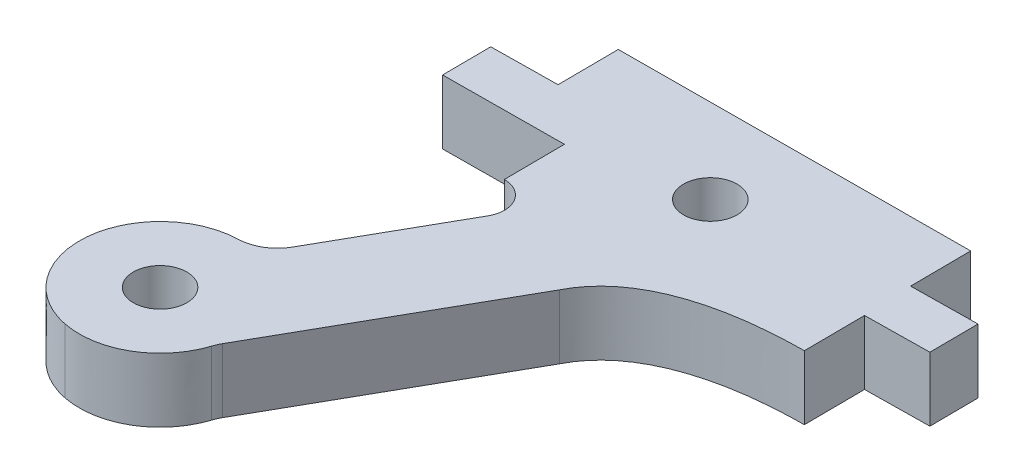
ISO-10303-21;
HEADER;
FILE_DESCRIPTION(('STEP AP214'),'2;1');
FILE_NAME('part.step','',(''),(''),'','','');
FILE_SCHEMA(('AUTOMOTIVE_DESIGN { 1 0 10303 214 1 1 1 1 }'));
ENDSEC;
DATA;
#1=APPLICATION_CONTEXT('core data for automotive mechanical design processes');
#2=APPLICATION_PROTOCOL_DEFINITION('international standard','automotive_design',2000,#1);
#3=PRODUCT_CONTEXT('',#1,'mechanical');
#4=PRODUCT('Part','Part','',(#3));
#5=PRODUCT_RELATED_PRODUCT_CATEGORY('part','',(#4));
#6=PRODUCT_DEFINITION_FORMATION('','',#4);
#7=PRODUCT_DEFINITION_CONTEXT('part definition',#1,'design');
#8=PRODUCT_DEFINITION('design','',#6,#7);
#9=PRODUCT_DEFINITION_SHAPE('','',#8);
#10=(LENGTH_UNIT() NAMED_UNIT(*) SI_UNIT(.MILLI.,.METRE.));
#11=(NAMED_UNIT(*) PLANE_ANGLE_UNIT() SI_UNIT($,.RADIAN.));
#12=(NAMED_UNIT(*) SI_UNIT($,.STERADIAN.) SOLID_ANGLE_UNIT());
#13=UNCERTAINTY_MEASURE_WITH_UNIT(LENGTH_MEASURE(1.E-05),#10,'distance_accuracy_value','');
#14=(GEOMETRIC_REPRESENTATION_CONTEXT(3) GLOBAL_UNCERTAINTY_ASSIGNED_CONTEXT((#13)) GLOBAL_UNIT_ASSIGNED_CONTEXT((#10,
#11,#12)) REPRESENTATION_CONTEXT('',''));
#15=CARTESIAN_POINT('',(0.,0.,0.));
#16=DIRECTION('',(0.,0.,1.));
#17=DIRECTION('',(1.,0.,0.));
#18=AXIS2_PLACEMENT_3D('',#15,#16,#17);
#19=CARTESIAN_POINT('',(-2.34833379742237,3.175,-1.86520467732021));
#20=DIRECTION('',(0.,1.,0.));
#21=DIRECTION('',(0.,0.,1.));
#22=AXIS2_PLACEMENT_3D('',#19,#20,#21);
#23=PLANE('',#22);
#24=CARTESIAN_POINT('',(2.95169046687696,3.175,-6.28082987669765));
#25=DIRECTION('',(0.,1.,0.));
#26=DIRECTION('',(0.,0.,1.));
#27=AXIS2_PLACEMENT_3D('',#24,#25,#26);
#28=CIRCLE('',#27,1.32389540963703);
#29=CARTESIAN_POINT('',(2.95169046687696,3.175,-4.95693446706062));
#30=VERTEX_POINT('',#29);
#31=EDGE_CURVE('E223',#30,#30,#28,.T.);
#32=ORIENTED_EDGE('',*,*,#31,.F.);
#33=EDGE_LOOP('',(#32));
#34=FACE_BOUND('',#33,.T.);
#35=DIRECTION('',(-0.999987225720745,0.,0.00505454204919025));
#36=VECTOR('',#35,1.);
#37=CARTESIAN_POINT('',(11.6055718938665,3.175,-10.5246438774155));
#38=LINE('',#37,#36);
#39=CARTESIAN_POINT('',(11.6055718938665,3.175,-10.5246438774155));
#40=VERTEX_POINT('',#39);
#41=CARTESIAN_POINT('',(-5.76646373639117,3.175,-10.4368350711481));
#42=VERTEX_POINT('',#41);
#43=EDGE_CURVE('E314',#40,#42,#38,.T.);
#44=ORIENTED_EDGE('',*,*,#43,.T.);
#45=DIRECTION('',(1.,0.,0.));
#46=VECTOR('',#45,1.);
#47=CARTESIAN_POINT('',(-5.76646373639117,3.175,-10.4368350711481));
#48=LINE('',#47,#46);
#49=CARTESIAN_POINT('',(-5.7633977894373,3.175,-10.4368350711481));
#50=VERTEX_POINT('',#49);
#51=EDGE_CURVE('E137',#42,#50,#48,.T.);
#52=ORIENTED_EDGE('',*,*,#51,.T.);
#53=DIRECTION('',(0.00730458912248284,0.,0.999973321132995));
#54=VECTOR('',#53,1.);
#55=CARTESIAN_POINT('',(-5.7633977894373,3.175,-10.4368350711481));
#56=LINE('',#55,#54);
#57=CARTESIAN_POINT('',(-5.74148284919351,3.175,-7.4367545449818));
#58=VERTEX_POINT('',#57);
#59=EDGE_CURVE('E431',#50,#58,#56,.T.);
#60=ORIENTED_EDGE('',*,*,#59,.T.);
#61=DIRECTION('',(0.,0.,1.));
#62=VECTOR('',#61,1.);
#63=CARTESIAN_POINT('',(-5.74148284919351,3.175,-7.4367545449818));
#64=LINE('',#63,#62);
#65=CARTESIAN_POINT('',(-5.74148284919351,3.175,-7.43457665998876));
#66=VERTEX_POINT('',#65);
#67=EDGE_CURVE('E450',#58,#66,#64,.T.);
#68=ORIENTED_EDGE('',*,*,#67,.T.);
#69=DIRECTION('',(-0.99991975145842,0.,0.0126684901756899));
#70=VECTOR('',#69,1.);
#71=CARTESIAN_POINT('',(-5.74148284919351,3.175,-7.43457665998876));
#72=LINE('',#71,#70);
#73=CARTESIAN_POINT('',(-9.03532860903988,3.175,-7.39284525845579));
#74=VERTEX_POINT('',#73);
#75=EDGE_CURVE('E447',#66,#74,#72,.T.);
#76=ORIENTED_EDGE('',*,*,#75,.T.);
#77=DIRECTION('',(0.00732152725886782,0.,0.999973197260105));
#78=VECTOR('',#77,1.);
#79=CARTESIAN_POINT('',(-9.03532860903988,3.175,-7.39284525845579));
#80=LINE('',#79,#78);
#81=CARTESIAN_POINT('',(-9.01775668742399,3.175,-4.9928745940071));
#82=VERTEX_POINT('',#81);
#83=EDGE_CURVE('E449',#74,#82,#80,.T.);
#84=ORIENTED_EDGE('',*,*,#83,.T.);
#85=DIRECTION('',(0.99997313805182,0.,-0.0073296094572015));
#86=VECTOR('',#85,1.);
#87=CARTESIAN_POINT('',(-9.01775668742399,3.175,-4.9928745940071));
#88=LINE('',#87,#86);
#89=CARTESIAN_POINT('',(-3.02857798229572,3.175,-5.03677411411171));
#90=VERTEX_POINT('',#89);
#91=EDGE_CURVE('E452',#82,#90,#88,.T.);
#92=ORIENTED_EDGE('',*,*,#91,.T.);
#93=DIRECTION('',(0.00723946370180525,0.,0.999973794739297));
#94=VECTOR('',#93,1.);
#95=CARTESIAN_POINT('',(-3.02857798229572,3.175,-5.03677411411171));
#96=LINE('',#95,#94);
#97=CARTESIAN_POINT('',(-3.00685801482997,3.175,-2.03663499014264));
#98=VERTEX_POINT('',#97);
#99=EDGE_CURVE('E458',#90,#98,#96,.T.);
#100=ORIENTED_EDGE('',*,*,#99,.T.);
#101=CARTESIAN_POINT('',(-3.00685801482997,3.175,-2.03663499014264));
#102=CARTESIAN_POINT('',(-2.53721245866417,3.175,-2.04027782017716));
#103=CARTESIAN_POINT('',(-2.10149216608579,3.175,-1.79245794707872));
#104=CARTESIAN_POINT('',(-1.86369849029905,3.175,-1.38679512665141));
#105=B_SPLINE_CURVE_WITH_KNOTS('',3,(#101,#102,#103,#104),.UNSPECIFIED.,.F.,.F.,(4,4),(7.,8.),.UNSPECIFIED.);
#106=CARTESIAN_POINT('',(-1.86369849029905,3.175,-1.38679512665141));
#107=VERTEX_POINT('',#106);
#108=EDGE_CURVE('E460',#98,#107,#105,.T.);
#109=ORIENTED_EDGE('',*,*,#108,.T.);
#110=CARTESIAN_POINT('',(-1.86369849029905,3.175,-1.38679512665141));
#111=CARTESIAN_POINT('',(-1.6259048145123,3.175,-0.981269034429327));
#112=CARTESIAN_POINT('',(-1.6223270640357,3.175,-0.479281193001224));
#113=CARTESIAN_POINT('',(-1.8541107039417,3.175,-0.0701025044446135));
#114=B_SPLINE_CURVE_WITH_KNOTS('',3,(#110,#111,#112,#113),.UNSPECIFIED.,.F.,.F.,(4,4),(8.,9.),.UNSPECIFIED.);
#115=CARTESIAN_POINT('',(-1.8541107039417,3.175,-0.0701025044446135));
#116=VERTEX_POINT('',#115);
#117=EDGE_CURVE('E465',#107,#116,#114,.T.);
#118=ORIENTED_EDGE('',*,*,#117,.T.);
#119=DIRECTION('',(-0.492967266484552,0.,0.870047857404838));
#120=VECTOR('',#119,1.);
#121=CARTESIAN_POINT('',(-1.8541107039417,3.175,-0.0701025044446135));
#122=LINE('',#121,#120);
#123=CARTESIAN_POINT('',(-5.35188824244559,3.175,6.10319552151964));
#124=VERTEX_POINT('',#123);
#125=EDGE_CURVE('E756',#116,#124,#122,.T.);
#126=ORIENTED_EDGE('',*,*,#125,.T.);
#127=CARTESIAN_POINT('',(-5.35188824244559,3.175,6.10319552151964));
#128=CARTESIAN_POINT('',(-5.69580072766479,3.175,6.71008319570995));
#129=CARTESIAN_POINT('',(-6.33040787799283,3.175,7.09346908484737));
#130=CARTESIAN_POINT('',(-7.02673366155127,3.175,7.115042842437));
#131=B_SPLINE_CURVE_WITH_KNOTS('',3,(#127,#128,#129,#130),.UNSPECIFIED.,.F.,.F.,(4,4),(10.,11.),.UNSPECIFIED.);
#132=CARTESIAN_POINT('',(-7.02673366155127,3.175,7.115042842437));
#133=VERTEX_POINT('',#132);
#134=EDGE_CURVE('E754',#124,#133,#131,.T.);
#135=ORIENTED_EDGE('',*,*,#134,.T.);
#136=CARTESIAN_POINT('',(-7.02673366155127,3.175,7.115042842437));
#137=CARTESIAN_POINT('',(-9.0532807283355,3.175,7.17763506171815));
#138=CARTESIAN_POINT('',(-10.7114462262083,3.175,8.75188455844386));
#139=CARTESIAN_POINT('',(-10.8824129820415,3.175,10.7759014883355));
#140=B_SPLINE_CURVE_WITH_KNOTS('',3,(#136,#137,#138,#139),.UNSPECIFIED.,.F.,.F.,(4,4),(11.,12.),.UNSPECIFIED.);
#141=CARTESIAN_POINT('',(-10.8824129820415,3.175,10.7759014883355));
#142=VERTEX_POINT('',#141);
#143=EDGE_CURVE('E747',#133,#142,#140,.T.);
#144=ORIENTED_EDGE('',*,*,#143,.T.);
#145=CARTESIAN_POINT('',(-10.8824129820415,3.175,10.7759014883355));
#146=CARTESIAN_POINT('',(-11.0531896394143,3.175,12.7999770160305));
#147=CARTESIAN_POINT('',(-9.68296969062521,3.175,14.6309532519513));
#148=CARTESIAN_POINT('',(-7.69558290655992,3.175,15.0339205735425));
#149=B_SPLINE_CURVE_WITH_KNOTS('',3,(#145,#146,#147,#148),.UNSPECIFIED.,.F.,.F.,(4,4),(12.,13.),.UNSPECIFIED.);
#150=CARTESIAN_POINT('',(-7.69558290655992,3.175,15.0339205735425));
#151=VERTEX_POINT('',#150);
#152=EDGE_CURVE('E744',#142,#151,#149,.T.);
#153=ORIENTED_EDGE('',*,*,#152,.T.);
#154=CARTESIAN_POINT('',(-7.69558290655992,3.175,15.0339205735425));
#155=CARTESIAN_POINT('',(-5.70832285480011,3.175,15.4367023354254));
#156=CARTESIAN_POINT('',(-3.73506184851524,3.175,14.2837222071964));
#157=CARTESIAN_POINT('',(-3.10716176172304,3.175,12.3522019085722));
#158=B_SPLINE_CURVE_WITH_KNOTS('',3,(#154,#155,#156,#157),.UNSPECIFIED.,.F.,.F.,(4,4),(13.,14.),.UNSPECIFIED.);
#159=CARTESIAN_POINT('',(-3.10716176172304,3.175,12.3522019085722));
#160=VERTEX_POINT('',#159);
#161=EDGE_CURVE('E742',#151,#160,#158,.T.);
#162=ORIENTED_EDGE('',*,*,#161,.T.);
#163=CARTESIAN_POINT('',(-3.10716176172304,3.175,12.3522019085722));
#164=CARTESIAN_POINT('',(-3.06550582744658,3.175,12.2244489328214));
#165=CARTESIAN_POINT('',(-3.01132776642687,3.175,12.1013056508669));
#166=CARTESIAN_POINT('',(-2.9450760160557,3.175,11.9842370077734));
#167=B_SPLINE_CURVE_WITH_KNOTS('',3,(#163,#164,#165,#166),.UNSPECIFIED.,.F.,.F.,(4,4),(14.,15.),.UNSPECIFIED.);
#168=CARTESIAN_POINT('',(-2.9450760160557,3.175,11.9842370077734));
#169=VERTEX_POINT('',#168);
#170=EDGE_CURVE('E735',#160,#169,#167,.T.);
#171=ORIENTED_EDGE('',*,*,#170,.T.);
#172=DIRECTION('',(0.49296810609439,0.,-0.870047381683153));
#173=VECTOR('',#172,1.);
#174=CARTESIAN_POINT('',(-2.9450760160557,3.175,11.9842370077734));
#175=LINE('',#174,#173);
#176=CARTESIAN_POINT('',(3.08812266876662,3.175,1.33614709280669));
#177=VERTEX_POINT('',#176);
#178=EDGE_CURVE('E351',#169,#177,#175,.T.);
#179=ORIENTED_EDGE('',*,*,#178,.T.);
#180=CARTESIAN_POINT('',(3.08812266876662,3.175,1.33614709280669));
#181=CARTESIAN_POINT('',(4.64362037551014,3.175,-1.75776804769434));
#182=CARTESIAN_POINT('',(9.32927931953659,3.175,-2.10684492328464));
#183=CARTESIAN_POINT('',(11.7667607643557,3.175,-2.12463912253474));
#184=B_SPLINE_CURVE_WITH_KNOTS('',3,(#180,#181,#182,#183),.UNSPECIFIED.,.F.,.F.,(4,4),(16.,17.),.UNSPECIFIED.);
#185=CARTESIAN_POINT('',(11.7667607643557,3.175,-2.12463912253474));
#186=VERTEX_POINT('',#185);
#187=EDGE_CURVE('E344',#177,#186,#184,.T.);
#188=ORIENTED_EDGE('',*,*,#187,.T.);
#189=CARTESIAN_POINT('',(11.7667607643557,3.175,-2.12463912253474));
#190=CARTESIAN_POINT('',(11.7448506984291,3.175,-5.12478801280389));
#191=CARTESIAN_POINT('',(11.7451675291956,3.175,-5.12478801280389));
#192=B_SPLINE_CURVE_WITH_KNOTS('',2,(#189,#190,#191),.UNSPECIFIED.,.F.,.F.,(3,3),(17.,18.),.UNSPECIFIED.);
#193=CARTESIAN_POINT('',(11.7451675291956,3.175,-5.12478801280389));
#194=VERTEX_POINT('',#193);
#195=EDGE_CURVE('E350',#186,#194,#192,.T.);
#196=ORIENTED_EDGE('',*,*,#195,.T.);
#197=CARTESIAN_POINT('',(11.7451675291956,3.175,-5.12478801280389));
#198=CARTESIAN_POINT('',(11.7455526004352,3.175,-5.12478801280389));
#199=CARTESIAN_POINT('',(14.9388996412547,3.175,-5.16868753303368));
#200=B_SPLINE_CURVE_WITH_KNOTS('',2,(#197,#198,#199),.UNSPECIFIED.,.F.,.F.,(3,3),(18.,19.),.UNSPECIFIED.);
#201=CARTESIAN_POINT('',(14.9388996412547,3.175,-5.16868753303368));
#202=VERTEX_POINT('',#201);
#203=EDGE_CURVE('E201',#194,#202,#200,.T.);
#204=ORIENTED_EDGE('',*,*,#203,.T.);
#205=DIRECTION('',(-0.00732170601639489,0.,-0.999973195951276));
#206=VECTOR('',#205,1.);
#207=CARTESIAN_POINT('',(14.9388996412547,3.175,-5.16868753303368));
#208=LINE('',#207,#206);
#209=CARTESIAN_POINT('',(14.9213277196389,3.175,-7.56859959968095));
#210=VERTEX_POINT('',#209);
#211=EDGE_CURVE('E195',#202,#210,#208,.T.);
#212=ORIENTED_EDGE('',*,*,#211,.T.);
#213=DIRECTION('',(-0.999911157728386,0.,0.0133295405126438));
#214=VECTOR('',#213,1.);
#215=CARTESIAN_POINT('',(14.9213277196389,3.175,-7.56859959968095));
#216=LINE('',#215,#214);
#217=CARTESIAN_POINT('',(11.6274868341102,3.175,-7.52469031315434));
#218=VERTEX_POINT('',#217);
#219=EDGE_CURVE('E199',#210,#218,#216,.T.);
#220=ORIENTED_EDGE('',*,*,#219,.T.);
#221=DIRECTION('',(-0.00730489824560402,0.,-0.999973318874869));
#222=VECTOR('',#221,1.);
#223=CARTESIAN_POINT('',(11.6274868341102,3.175,-7.52469031315434));
#224=LINE('',#223,#222);
#225=EDGE_CURVE('E49',#218,#40,#224,.T.);
#226=ORIENTED_EDGE('',*,*,#225,.T.);
#227=EDGE_LOOP('',(#44,#52,#60,#68,#76,#84,#92,#100,#109,#118,#126,#135,#144,#153,#162,#171,
#179,#188,#196,#204,#212,#220,#226));
#228=FACE_BOUND('',#227,.T.);
#229=CARTESIAN_POINT('',(-6.90368390363125,3.175,11.1132050891636));
#230=DIRECTION('',(0.,1.,0.));
#231=DIRECTION('',(0.,0.,1.));
#232=AXIS2_PLACEMENT_3D('',#229,#230,#231);
#233=CIRCLE('',#232,1.323699758442);
#234=CARTESIAN_POINT('',(-6.90368390363125,3.175,12.4369048476056));
#235=VERTEX_POINT('',#234);
#236=EDGE_CURVE('E712',#235,#235,#233,.T.);
#237=ORIENTED_EDGE('',*,*,#236,.F.);
#238=EDGE_LOOP('',(#237));
#239=FACE_BOUND('',#238,.T.);
#240=ADVANCED_FACE('F32',(#34,#228,#239),#23,.T.);
#241=CARTESIAN_POINT('',(-2.34833379742237,0.,-1.86520467732021));
#242=DIRECTION('',(0.,1.,0.));
#243=DIRECTION('',(0.,0.,1.));
#244=AXIS2_PLACEMENT_3D('',#241,#242,#243);
#245=PLANE('',#244);
#246=DIRECTION('',(-0.999987225720745,0.,0.00505454204919025));
#247=VECTOR('',#246,1.);
#248=CARTESIAN_POINT('',(11.6055718938665,0.,-10.5246438774155));
#249=LINE('',#248,#247);
#250=CARTESIAN_POINT('',(11.6055718938665,0.,-10.5246438774155));
#251=VERTEX_POINT('',#250);
#252=CARTESIAN_POINT('',(-5.76646373639117,0.,-10.4368350711481));
#253=VERTEX_POINT('',#252);
#254=EDGE_CURVE('E219',#251,#253,#249,.T.);
#255=ORIENTED_EDGE('',*,*,#254,.F.);
#256=DIRECTION('',(-0.00730489824560402,0.,-0.999973318874869));
#257=VECTOR('',#256,1.);
#258=CARTESIAN_POINT('',(11.6274868341102,0.,-7.52469031315434));
#259=LINE('',#258,#257);
#260=CARTESIAN_POINT('',(11.6274868341102,0.,-7.52469031315434));
#261=VERTEX_POINT('',#260);
#262=EDGE_CURVE('E129',#261,#251,#259,.T.);
#263=ORIENTED_EDGE('',*,*,#262,.F.);
#264=DIRECTION('',(-0.999911157728386,0.,0.0133295405126438));
#265=VECTOR('',#264,1.);
#266=CARTESIAN_POINT('',(14.9213277196389,0.,-7.56859959968095));
#267=LINE('',#266,#265);
#268=CARTESIAN_POINT('',(14.9213277196389,0.,-7.56859959968095));
#269=VERTEX_POINT('',#268);
#270=EDGE_CURVE('E123',#269,#261,#267,.T.);
#271=ORIENTED_EDGE('',*,*,#270,.F.);
#272=DIRECTION('',(-0.00732170601639489,0.,-0.999973195951276));
#273=VECTOR('',#272,1.);
#274=CARTESIAN_POINT('',(14.9388996412547,0.,-5.16868753303368));
#275=LINE('',#274,#273);
#276=CARTESIAN_POINT('',(14.9388996412547,0.,-5.16868753303368));
#277=VERTEX_POINT('',#276);
#278=EDGE_CURVE('E209',#277,#269,#275,.T.);
#279=ORIENTED_EDGE('',*,*,#278,.F.);
#280=CARTESIAN_POINT('',(11.7451675291956,0.,-5.12478801280389));
#281=CARTESIAN_POINT('',(11.7455526004352,0.,-5.12478801280389));
#282=CARTESIAN_POINT('',(14.9388996412547,0.,-5.16868753303368));
#283=B_SPLINE_CURVE_WITH_KNOTS('',2,(#280,#281,#282),.UNSPECIFIED.,.F.,.F.,(3,3),(18.,19.),.UNSPECIFIED.);
#284=CARTESIAN_POINT('',(11.7451675291956,0.,-5.12478801280389));
#285=VERTEX_POINT('',#284);
#286=EDGE_CURVE('E301',#285,#277,#283,.T.);
#287=ORIENTED_EDGE('',*,*,#286,.F.);
#288=CARTESIAN_POINT('',(11.7667607643557,0.,-2.12463912253474));
#289=CARTESIAN_POINT('',(11.7448506984291,0.,-5.12478801280389));
#290=CARTESIAN_POINT('',(11.7451675291956,0.,-5.12478801280389));
#291=B_SPLINE_CURVE_WITH_KNOTS('',2,(#288,#289,#290),.UNSPECIFIED.,.F.,.F.,(3,3),(17.,18.),.UNSPECIFIED.);
#292=CARTESIAN_POINT('',(11.7667607643557,0.,-2.12463912253474));
#293=VERTEX_POINT('',#292);
#294=EDGE_CURVE('E294',#293,#285,#291,.T.);
#295=ORIENTED_EDGE('',*,*,#294,.F.);
#296=CARTESIAN_POINT('',(3.08812266876662,0.,1.33614709280669));
#297=CARTESIAN_POINT('',(4.64362037551014,0.,-1.75776804769434));
#298=CARTESIAN_POINT('',(9.32927931953659,0.,-2.10684492328464));
#299=CARTESIAN_POINT('',(11.7667607643557,0.,-2.12463912253474));
#300=B_SPLINE_CURVE_WITH_KNOTS('',3,(#296,#297,#298,#299),.UNSPECIFIED.,.F.,.F.,(4,4),(16.,17.),.UNSPECIFIED.);
#301=CARTESIAN_POINT('',(3.08812266876662,0.,1.33614709280669));
#302=VERTEX_POINT('',#301);
#303=EDGE_CURVE('E290',#302,#293,#300,.T.);
#304=ORIENTED_EDGE('',*,*,#303,.F.);
#305=DIRECTION('',(0.49296810609439,0.,-0.870047381683153));
#306=VECTOR('',#305,1.);
#307=CARTESIAN_POINT('',(-2.9450760160557,0.,11.9842370077734));
#308=LINE('',#307,#306);
#309=CARTESIAN_POINT('',(-2.9450760160557,0.,11.9842370077734));
#310=VERTEX_POINT('',#309);
#311=EDGE_CURVE('E285',#310,#302,#308,.T.);
#312=ORIENTED_EDGE('',*,*,#311,.F.);
#313=CARTESIAN_POINT('',(-3.10716176172304,0.,12.3522019085722));
#314=CARTESIAN_POINT('',(-3.06550582744658,0.,12.2244489328214));
#315=CARTESIAN_POINT('',(-3.01132776642687,0.,12.1013056508669));
#316=CARTESIAN_POINT('',(-2.9450760160557,0.,11.9842370077734));
#317=B_SPLINE_CURVE_WITH_KNOTS('',3,(#313,#314,#315,#316),.UNSPECIFIED.,.F.,.F.,(4,4),(14.,15.),.UNSPECIFIED.);
#318=CARTESIAN_POINT('',(-3.10716176172304,0.,12.3522019085722));
#319=VERTEX_POINT('',#318);
#320=EDGE_CURVE('E278',#319,#310,#317,.T.);
#321=ORIENTED_EDGE('',*,*,#320,.F.);
#322=CARTESIAN_POINT('',(-7.69558290655992,0.,15.0339205735425));
#323=CARTESIAN_POINT('',(-5.70832285480011,0.,15.4367023354254));
#324=CARTESIAN_POINT('',(-3.73506184851524,0.,14.2837222071964));
#325=CARTESIAN_POINT('',(-3.10716176172304,0.,12.3522019085722));
#326=B_SPLINE_CURVE_WITH_KNOTS('',3,(#322,#323,#324,#325),.UNSPECIFIED.,.F.,.F.,(4,4),(13.,14.),.UNSPECIFIED.);
#327=CARTESIAN_POINT('',(-7.69558290655992,0.,15.0339205735425));
#328=VERTEX_POINT('',#327);
#329=EDGE_CURVE('E271',#328,#319,#326,.T.);
#330=ORIENTED_EDGE('',*,*,#329,.F.);
#331=CARTESIAN_POINT('',(-10.8824129820415,0.,10.7759014883355));
#332=CARTESIAN_POINT('',(-11.0531896394143,0.,12.7999770160305));
#333=CARTESIAN_POINT('',(-9.68296969062521,0.,14.6309532519513));
#334=CARTESIAN_POINT('',(-7.69558290655992,0.,15.0339205735425));
#335=B_SPLINE_CURVE_WITH_KNOTS('',3,(#331,#332,#333,#334),.UNSPECIFIED.,.F.,.F.,(4,4),(12.,13.),.UNSPECIFIED.);
#336=CARTESIAN_POINT('',(-10.8824129820415,0.,10.7759014883355));
#337=VERTEX_POINT('',#336);
#338=EDGE_CURVE('E264',#337,#328,#335,.T.);
#339=ORIENTED_EDGE('',*,*,#338,.F.);
#340=CARTESIAN_POINT('',(-7.02673366155127,0.,7.115042842437));
#341=CARTESIAN_POINT('',(-9.0532807283355,0.,7.17763506171815));
#342=CARTESIAN_POINT('',(-10.7114462262083,0.,8.75188455844386));
#343=CARTESIAN_POINT('',(-10.8824129820415,0.,10.7759014883355));
#344=B_SPLINE_CURVE_WITH_KNOTS('',3,(#340,#341,#342,#343),.UNSPECIFIED.,.F.,.F.,(4,4),(11.,12.),.UNSPECIFIED.);
#345=CARTESIAN_POINT('',(-7.02673366155127,0.,7.115042842437));
#346=VERTEX_POINT('',#345);
#347=EDGE_CURVE('E257',#346,#337,#344,.T.);
#348=ORIENTED_EDGE('',*,*,#347,.F.);
#349=CARTESIAN_POINT('',(-5.35188824244559,0.,6.10319552151964));
#350=CARTESIAN_POINT('',(-5.69580072766479,0.,6.71008319570995));
#351=CARTESIAN_POINT('',(-6.33040787799283,0.,7.09346908484737));
#352=CARTESIAN_POINT('',(-7.02673366155127,0.,7.115042842437));
#353=B_SPLINE_CURVE_WITH_KNOTS('',3,(#349,#350,#351,#352),.UNSPECIFIED.,.F.,.F.,(4,4),(10.,11.),.UNSPECIFIED.);
#354=CARTESIAN_POINT('',(-5.35188824244559,0.,6.10319552151964));
#355=VERTEX_POINT('',#354);
#356=EDGE_CURVE('E253',#355,#346,#353,.T.);
#357=ORIENTED_EDGE('',*,*,#356,.F.);
#358=DIRECTION('',(-0.492967266484552,0.,0.870047857404838));
#359=VECTOR('',#358,1.);
#360=CARTESIAN_POINT('',(-1.8541107039417,0.,-0.0701025044446135));
#361=LINE('',#360,#359);
#362=CARTESIAN_POINT('',(-1.8541107039417,0.,-0.0701025044446135));
#363=VERTEX_POINT('',#362);
#364=EDGE_CURVE('E248',#363,#355,#361,.T.);
#365=ORIENTED_EDGE('',*,*,#364,.F.);
#366=CARTESIAN_POINT('',(-1.86369849029905,0.,-1.38679512665141));
#367=CARTESIAN_POINT('',(-1.6259048145123,0.,-0.981269034429327));
#368=CARTESIAN_POINT('',(-1.6223270640357,0.,-0.479281193001224));
#369=CARTESIAN_POINT('',(-1.8541107039417,0.,-0.0701025044446135));
#370=B_SPLINE_CURVE_WITH_KNOTS('',3,(#366,#367,#368,#369),.UNSPECIFIED.,.F.,.F.,(4,4),(8.,9.),.UNSPECIFIED.);
#371=CARTESIAN_POINT('',(-1.86369849029905,0.,-1.38679512665141));
#372=VERTEX_POINT('',#371);
#373=EDGE_CURVE('E241',#372,#363,#370,.T.);
#374=ORIENTED_EDGE('',*,*,#373,.F.);
#375=CARTESIAN_POINT('',(-3.00685801482997,0.,-2.03663499014264));
#376=CARTESIAN_POINT('',(-2.53721245866417,0.,-2.04027782017716));
#377=CARTESIAN_POINT('',(-2.10149216608579,0.,-1.79245794707872));
#378=CARTESIAN_POINT('',(-1.86369849029905,0.,-1.38679512665141));
#379=B_SPLINE_CURVE_WITH_KNOTS('',3,(#375,#376,#377,#378),.UNSPECIFIED.,.F.,.F.,(4,4),(7.,8.),.UNSPECIFIED.);
#380=CARTESIAN_POINT('',(-3.00685801482997,0.,-2.03663499014264));
#381=VERTEX_POINT('',#380);
#382=EDGE_CURVE('E237',#381,#372,#379,.T.);
#383=ORIENTED_EDGE('',*,*,#382,.F.);
#384=DIRECTION('',(0.00723946370180525,0.,0.999973794739297));
#385=VECTOR('',#384,1.);
#386=CARTESIAN_POINT('',(-3.02857798229572,0.,-5.03677411411171));
#387=LINE('',#386,#385);
#388=CARTESIAN_POINT('',(-3.02857798229572,0.,-5.03677411411171));
#389=VERTEX_POINT('',#388);
#390=EDGE_CURVE('E235',#389,#381,#387,.T.);
#391=ORIENTED_EDGE('',*,*,#390,.F.);
#392=DIRECTION('',(0.99997313805182,0.,-0.0073296094572015));
#393=VECTOR('',#392,1.);
#394=CARTESIAN_POINT('',(-9.01775668742399,0.,-4.9928745940071));
#395=LINE('',#394,#393);
#396=CARTESIAN_POINT('',(-9.01775668742399,0.,-4.9928745940071));
#397=VERTEX_POINT('',#396);
#398=EDGE_CURVE('E233',#397,#389,#395,.T.);
#399=ORIENTED_EDGE('',*,*,#398,.F.);
#400=DIRECTION('',(0.00732152725886782,0.,0.999973197260105));
#401=VECTOR('',#400,1.);
#402=CARTESIAN_POINT('',(-9.03532860903988,0.,-7.39284525845579));
#403=LINE('',#402,#401);
#404=CARTESIAN_POINT('',(-9.03532860903988,0.,-7.39284525845579));
#405=VERTEX_POINT('',#404);
#406=EDGE_CURVE('E231',#405,#397,#403,.T.);
#407=ORIENTED_EDGE('',*,*,#406,.F.);
#408=DIRECTION('',(-0.99991975145842,0.,0.0126684901756899));
#409=VECTOR('',#408,1.);
#410=CARTESIAN_POINT('',(-5.74148284919351,0.,-7.43457665998876));
#411=LINE('',#410,#409);
#412=CARTESIAN_POINT('',(-5.74148284919351,0.,-7.43457665998876));
#413=VERTEX_POINT('',#412);
#414=EDGE_CURVE('E229',#413,#405,#411,.T.);
#415=ORIENTED_EDGE('',*,*,#414,.F.);
#416=DIRECTION('',(0.,0.,1.));
#417=VECTOR('',#416,1.);
#418=CARTESIAN_POINT('',(-5.74148284919351,0.,-7.4367545449818));
#419=LINE('',#418,#417);
#420=CARTESIAN_POINT('',(-5.74148284919351,0.,-7.4367545449818));
#421=VERTEX_POINT('',#420);
#422=EDGE_CURVE('E227',#421,#413,#419,.T.);
#423=ORIENTED_EDGE('',*,*,#422,.F.);
#424=DIRECTION('',(0.00730458912248284,0.,0.999973321132995));
#425=VECTOR('',#424,1.);
#426=CARTESIAN_POINT('',(-5.7633977894373,0.,-10.4368350711481));
#427=LINE('',#426,#425);
#428=CARTESIAN_POINT('',(-5.7633977894373,0.,-10.4368350711481));
#429=VERTEX_POINT('',#428);
#430=EDGE_CURVE('E225',#429,#421,#427,.T.);
#431=ORIENTED_EDGE('',*,*,#430,.F.);
#432=DIRECTION('',(1.,0.,0.));
#433=VECTOR('',#432,1.);
#434=CARTESIAN_POINT('',(-5.76646373639117,0.,-10.4368350711481));
#435=LINE('',#434,#433);
#436=EDGE_CURVE('E222',#253,#429,#435,.T.);
#437=ORIENTED_EDGE('',*,*,#436,.F.);
#438=EDGE_LOOP('',(#255,#263,#271,#279,#287,#295,#304,#312,#321,#330,#339,#348,#357,#365,#374,
#383,#391,#399,#407,#415,#423,#431,#437));
#439=FACE_BOUND('',#438,.T.);
#440=CARTESIAN_POINT('',(2.95169046687696,0.,-6.28082987669765));
#441=DIRECTION('',(0.,1.,0.));
#442=DIRECTION('',(0.,0.,1.));
#443=AXIS2_PLACEMENT_3D('',#440,#441,#442);
#444=CIRCLE('',#443,1.32389540963703);
#445=CARTESIAN_POINT('',(2.95169046687696,0.,-4.95693446706062));
#446=VERTEX_POINT('',#445);
#447=EDGE_CURVE('E718',#446,#446,#444,.T.);
#448=ORIENTED_EDGE('',*,*,#447,.T.);
#449=EDGE_LOOP('',(#448));
#450=FACE_BOUND('',#449,.T.);
#451=CARTESIAN_POINT('',(-6.90368390363125,0.,11.1132050891636));
#452=DIRECTION('',(0.,1.,0.));
#453=DIRECTION('',(0.,0.,1.));
#454=AXIS2_PLACEMENT_3D('',#451,#452,#453);
#455=CIRCLE('',#454,1.323699758442);
#456=CARTESIAN_POINT('',(-6.90368390363125,0.,12.4369048476056));
#457=VERTEX_POINT('',#456);
#458=EDGE_CURVE('E715',#457,#457,#455,.T.);
#459=ORIENTED_EDGE('',*,*,#458,.T.);
#460=EDGE_LOOP('',(#459));
#461=FACE_BOUND('',#460,.T.);
#462=ADVANCED_FACE('F435',(#439,#450,#461),#245,.F.);
#463=CARTESIAN_POINT('',(11.6055718938665,3.175,-10.5246438774155));
#464=DIRECTION('',(0.00505454204919025,0.,0.999987225720745));
#465=DIRECTION('',(0.999987225720745,0.,-0.00505454204919025));
#466=AXIS2_PLACEMENT_3D('',#463,#464,#465);
#467=PLANE('',#466);
#468=ORIENTED_EDGE('',*,*,#254,.T.);
#469=DIRECTION('',(0.,-1.,0.));
#470=VECTOR('',#469,1.);
#471=CARTESIAN_POINT('',(-5.76646373639117,3.175,-10.4368350711481));
#472=LINE('',#471,#470);
#473=EDGE_CURVE('E11',#42,#253,#472,.T.);
#474=ORIENTED_EDGE('',*,*,#473,.F.);
#475=ORIENTED_EDGE('',*,*,#43,.F.);
#476=DIRECTION('',(0.,-1.,0.));
#477=VECTOR('',#476,1.);
#478=CARTESIAN_POINT('',(11.6055718938665,3.175,-10.5246438774155));
#479=LINE('',#478,#477);
#480=EDGE_CURVE('E215',#40,#251,#479,.T.);
#481=ORIENTED_EDGE('',*,*,#480,.T.);
#482=EDGE_LOOP('',(#468,#474,#475,#481));
#483=FACE_BOUND('',#482,.T.);
#484=ADVANCED_FACE('F34',(#483),#467,.F.);
#485=CARTESIAN_POINT('',(-5.76646373639117,3.175,-10.4368350711481));
#486=DIRECTION('',(0.,0.,-1.));
#487=DIRECTION('',(-1.,0.,0.));
#488=AXIS2_PLACEMENT_3D('',#485,#486,#487);
#489=PLANE('',#488);
#490=ORIENTED_EDGE('',*,*,#436,.T.);
#491=DIRECTION('',(0.,-1.,0.));
#492=VECTOR('',#491,1.);
#493=CARTESIAN_POINT('',(-5.7633977894373,3.175,-10.4368350711481));
#494=LINE('',#493,#492);
#495=EDGE_CURVE('E41',#50,#429,#494,.T.);
#496=ORIENTED_EDGE('',*,*,#495,.F.);
#497=ORIENTED_EDGE('',*,*,#51,.F.);
#498=ORIENTED_EDGE('',*,*,#473,.T.);
#499=EDGE_LOOP('',(#490,#496,#497,#498));
#500=FACE_BOUND('',#499,.T.);
#501=ADVANCED_FACE('F498',(#500),#489,.F.);
#502=CARTESIAN_POINT('',(-5.7633977894373,3.175,-10.4368350711481));
#503=DIRECTION('',(0.999973321132995,0.,-0.00730458912248284));
#504=DIRECTION('',(-0.00730458912248284,0.,-0.999973321132995));
#505=AXIS2_PLACEMENT_3D('',#502,#503,#504);
#506=PLANE('',#505);
#507=ORIENTED_EDGE('',*,*,#430,.T.);
#508=DIRECTION('',(0.,-1.,0.));
#509=VECTOR('',#508,1.);
#510=CARTESIAN_POINT('',(-5.74148284919351,3.175,-7.4367545449818));
#511=LINE('',#510,#509);
#512=EDGE_CURVE('E423',#58,#421,#511,.T.);
#513=ORIENTED_EDGE('',*,*,#512,.F.);
#514=ORIENTED_EDGE('',*,*,#59,.F.);
#515=ORIENTED_EDGE('',*,*,#495,.T.);
#516=EDGE_LOOP('',(#507,#513,#514,#515));
#517=FACE_BOUND('',#516,.T.);
#518=ADVANCED_FACE('F429',(#517),#506,.F.);
#519=CARTESIAN_POINT('',(-5.74148284919351,3.175,-7.4367545449818));
#520=DIRECTION('',(1.,0.,0.));
#521=DIRECTION('',(0.,0.,-1.));
#522=AXIS2_PLACEMENT_3D('',#519,#520,#521);
#523=PLANE('',#522);
#524=ORIENTED_EDGE('',*,*,#422,.T.);
#525=DIRECTION('',(0.,-1.,0.));
#526=VECTOR('',#525,1.);
#527=CARTESIAN_POINT('',(-5.74148284919351,3.175,-7.43457665998876));
#528=LINE('',#527,#526);
#529=EDGE_CURVE('E420',#66,#413,#528,.T.);
#530=ORIENTED_EDGE('',*,*,#529,.F.);
#531=ORIENTED_EDGE('',*,*,#67,.F.);
#532=ORIENTED_EDGE('',*,*,#512,.T.);
#533=EDGE_LOOP('',(#524,#530,#531,#532));
#534=FACE_BOUND('',#533,.T.);
#535=ADVANCED_FACE('F441',(#534),#523,.F.);
#536=CARTESIAN_POINT('',(-5.74148284919351,3.175,-7.43457665998876));
#537=DIRECTION('',(0.0126684901756899,0.,0.99991975145842));
#538=DIRECTION('',(0.99991975145842,0.,-0.01266849017569));
#539=AXIS2_PLACEMENT_3D('',#536,#537,#538);
#540=PLANE('',#539);
#541=ORIENTED_EDGE('',*,*,#414,.T.);
#542=DIRECTION('',(0.,-1.,0.));
#543=VECTOR('',#542,1.);
#544=CARTESIAN_POINT('',(-9.03532860903988,3.175,-7.39284525845579));
#545=LINE('',#544,#543);
#546=EDGE_CURVE('E417',#74,#405,#545,.T.);
#547=ORIENTED_EDGE('',*,*,#546,.F.);
#548=ORIENTED_EDGE('',*,*,#75,.F.);
#549=ORIENTED_EDGE('',*,*,#529,.T.);
#550=EDGE_LOOP('',(#541,#547,#548,#549));
#551=FACE_BOUND('',#550,.T.);
#552=ADVANCED_FACE('F445',(#551),#540,.F.);
#553=CARTESIAN_POINT('',(-9.03532860903988,3.175,-7.39284525845579));
#554=DIRECTION('',(0.999973197260105,0.,-0.00732152725886781));
#555=DIRECTION('',(-0.00732152725886782,0.,-0.999973197260105));
#556=AXIS2_PLACEMENT_3D('',#553,#554,#555);
#557=PLANE('',#556);
#558=ORIENTED_EDGE('',*,*,#406,.T.);
#559=DIRECTION('',(0.,-1.,0.));
#560=VECTOR('',#559,1.);
#561=CARTESIAN_POINT('',(-9.01775668742399,3.175,-4.9928745940071));
#562=LINE('',#561,#560);
#563=EDGE_CURVE('E414',#82,#397,#562,.T.);
#564=ORIENTED_EDGE('',*,*,#563,.F.);
#565=ORIENTED_EDGE('',*,*,#83,.F.);
#566=ORIENTED_EDGE('',*,*,#546,.T.);
#567=EDGE_LOOP('',(#558,#564,#565,#566));
#568=FACE_BOUND('',#567,.T.);
#569=ADVANCED_FACE('F488',(#568),#557,.F.);
#570=CARTESIAN_POINT('',(-9.01775668742399,3.175,-4.9928745940071));
#571=DIRECTION('',(-0.0073296094572015,0.,-0.99997313805182));
#572=DIRECTION('',(-0.99997313805182,0.,0.0073296094572015));
#573=AXIS2_PLACEMENT_3D('',#570,#571,#572);
#574=PLANE('',#573);
#575=ORIENTED_EDGE('',*,*,#398,.T.);
#576=DIRECTION('',(0.,-1.,0.));
#577=VECTOR('',#576,1.);
#578=CARTESIAN_POINT('',(-3.02857798229572,3.175,-5.03677411411171));
#579=LINE('',#578,#577);
#580=EDGE_CURVE('E411',#90,#389,#579,.T.);
#581=ORIENTED_EDGE('',*,*,#580,.F.);
#582=ORIENTED_EDGE('',*,*,#91,.F.);
#583=ORIENTED_EDGE('',*,*,#563,.T.);
#584=EDGE_LOOP('',(#575,#581,#582,#583));
#585=FACE_BOUND('',#584,.T.);
#586=ADVANCED_FACE('F484',(#585),#574,.F.);
#587=CARTESIAN_POINT('',(-3.02857798229572,3.175,-5.03677411411171));
#588=DIRECTION('',(0.999973794739297,0.,-0.00723946370180525));
#589=DIRECTION('',(-0.00723946370180525,0.,-0.999973794739297));
#590=AXIS2_PLACEMENT_3D('',#587,#588,#589);
#591=PLANE('',#590);
#592=ORIENTED_EDGE('',*,*,#390,.T.);
#593=DIRECTION('',(0.,-1.,0.));
#594=VECTOR('',#593,1.);
#595=CARTESIAN_POINT('',(-3.00685801482997,3.175,-2.03663499014264));
#596=LINE('',#595,#594);
#597=EDGE_CURVE('E408',#98,#381,#596,.T.);
#598=ORIENTED_EDGE('',*,*,#597,.F.);
#599=ORIENTED_EDGE('',*,*,#99,.F.);
#600=ORIENTED_EDGE('',*,*,#580,.T.);
#601=EDGE_LOOP('',(#592,#598,#599,#600));
#602=FACE_BOUND('',#601,.T.);
#603=ADVANCED_FACE('F479',(#602),#591,.F.);
#604=DIRECTION('',(0.,-1.,0.));
#605=VECTOR('',#604,1.);
#606=SURFACE_OF_LINEAR_EXTRUSION('',#105,#605);
#607=ORIENTED_EDGE('',*,*,#382,.T.);
#608=DIRECTION('',(0.,-1.,0.));
#609=VECTOR('',#608,1.);
#610=CARTESIAN_POINT('',(-1.86369849029905,3.175,-1.38679512665141));
#611=LINE('',#610,#609);
#612=EDGE_CURVE('E405',#107,#372,#611,.T.);
#613=ORIENTED_EDGE('',*,*,#612,.F.);
#614=ORIENTED_EDGE('',*,*,#108,.F.);
#615=ORIENTED_EDGE('',*,*,#597,.T.);
#616=EDGE_LOOP('',(#607,#613,#614,#615));
#617=FACE_BOUND('',#616,.T.);
#618=ADVANCED_FACE('F474',(#617),#606,.F.);
#619=DIRECTION('',(0.,-1.,0.));
#620=VECTOR('',#619,1.);
#621=SURFACE_OF_LINEAR_EXTRUSION('',#114,#620);
#622=ORIENTED_EDGE('',*,*,#373,.T.);
#623=DIRECTION('',(0.,-1.,0.));
#624=VECTOR('',#623,1.);
#625=CARTESIAN_POINT('',(-1.8541107039417,3.175,-0.0701025044446135));
#626=LINE('',#625,#624);
#627=EDGE_CURVE('E402',#116,#363,#626,.T.);
#628=ORIENTED_EDGE('',*,*,#627,.F.);
#629=ORIENTED_EDGE('',*,*,#117,.F.);
#630=ORIENTED_EDGE('',*,*,#612,.T.);
#631=EDGE_LOOP('',(#622,#628,#629,#630));
#632=FACE_BOUND('',#631,.T.);
#633=ADVANCED_FACE('F478',(#632),#621,.F.);
#634=CARTESIAN_POINT('',(-1.8541107039417,3.175,-0.0701025044446135));
#635=DIRECTION('',(0.870047857404838,0.,0.492967266484552));
#636=DIRECTION('',(0.492967266484552,0.,-0.870047857404838));
#637=AXIS2_PLACEMENT_3D('',#634,#635,#636);
#638=PLANE('',#637);
#639=ORIENTED_EDGE('',*,*,#364,.T.);
#640=DIRECTION('',(0.,-1.,0.));
#641=VECTOR('',#640,1.);
#642=CARTESIAN_POINT('',(-5.35188824244559,3.175,6.10319552151964));
#643=LINE('',#642,#641);
#644=EDGE_CURVE('E399',#124,#355,#643,.T.);
#645=ORIENTED_EDGE('',*,*,#644,.F.);
#646=ORIENTED_EDGE('',*,*,#125,.F.);
#647=ORIENTED_EDGE('',*,*,#627,.T.);
#648=EDGE_LOOP('',(#639,#645,#646,#647));
#649=FACE_BOUND('',#648,.T.);
#650=ADVANCED_FACE('F580',(#649),#638,.F.);
#651=DIRECTION('',(0.,-1.,0.));
#652=VECTOR('',#651,1.);
#653=SURFACE_OF_LINEAR_EXTRUSION('',#131,#652);
#654=ORIENTED_EDGE('',*,*,#356,.T.);
#655=DIRECTION('',(0.,-1.,0.));
#656=VECTOR('',#655,1.);
#657=CARTESIAN_POINT('',(-7.02673366155127,3.175,7.115042842437));
#658=LINE('',#657,#656);
#659=EDGE_CURVE('E396',#133,#346,#658,.T.);
#660=ORIENTED_EDGE('',*,*,#659,.F.);
#661=ORIENTED_EDGE('',*,*,#134,.F.);
#662=ORIENTED_EDGE('',*,*,#644,.T.);
#663=EDGE_LOOP('',(#654,#660,#661,#662));
#664=FACE_BOUND('',#663,.T.);
#665=ADVANCED_FACE('F572',(#664),#653,.F.);
#666=DIRECTION('',(0.,-1.,0.));
#667=VECTOR('',#666,1.);
#668=SURFACE_OF_LINEAR_EXTRUSION('',#140,#667);
#669=ORIENTED_EDGE('',*,*,#347,.T.);
#670=DIRECTION('',(0.,-1.,0.));
#671=VECTOR('',#670,1.);
#672=CARTESIAN_POINT('',(-10.8824129820415,3.175,10.7759014883355));
#673=LINE('',#672,#671);
#674=EDGE_CURVE('E393',#142,#337,#673,.T.);
#675=ORIENTED_EDGE('',*,*,#674,.F.);
#676=ORIENTED_EDGE('',*,*,#143,.F.);
#677=ORIENTED_EDGE('',*,*,#659,.T.);
#678=EDGE_LOOP('',(#669,#675,#676,#677));
#679=FACE_BOUND('',#678,.T.);
#680=ADVANCED_FACE('F564',(#679),#668,.F.);
#681=DIRECTION('',(0.,-1.,0.));
#682=VECTOR('',#681,1.);
#683=SURFACE_OF_LINEAR_EXTRUSION('',#149,#682);
#684=ORIENTED_EDGE('',*,*,#338,.T.);
#685=DIRECTION('',(0.,-1.,0.));
#686=VECTOR('',#685,1.);
#687=CARTESIAN_POINT('',(-7.69558290655992,3.175,15.0339205735425));
#688=LINE('',#687,#686);
#689=EDGE_CURVE('E390',#151,#328,#688,.T.);
#690=ORIENTED_EDGE('',*,*,#689,.F.);
#691=ORIENTED_EDGE('',*,*,#152,.F.);
#692=ORIENTED_EDGE('',*,*,#674,.T.);
#693=EDGE_LOOP('',(#684,#690,#691,#692));
#694=FACE_BOUND('',#693,.T.);
#695=ADVANCED_FACE('F556',(#694),#683,.F.);
#696=DIRECTION('',(0.,-1.,0.));
#697=VECTOR('',#696,1.);
#698=SURFACE_OF_LINEAR_EXTRUSION('',#158,#697);
#699=ORIENTED_EDGE('',*,*,#329,.T.);
#700=DIRECTION('',(0.,-1.,0.));
#701=VECTOR('',#700,1.);
#702=CARTESIAN_POINT('',(-3.10716176172304,3.175,12.3522019085722));
#703=LINE('',#702,#701);
#704=EDGE_CURVE('E387',#160,#319,#703,.T.);
#705=ORIENTED_EDGE('',*,*,#704,.F.);
#706=ORIENTED_EDGE('',*,*,#161,.F.);
#707=ORIENTED_EDGE('',*,*,#689,.T.);
#708=EDGE_LOOP('',(#699,#705,#706,#707));
#709=FACE_BOUND('',#708,.T.);
#710=ADVANCED_FACE('F549',(#709),#698,.F.);
#711=DIRECTION('',(0.,-1.,0.));
#712=VECTOR('',#711,1.);
#713=SURFACE_OF_LINEAR_EXTRUSION('',#167,#712);
#714=ORIENTED_EDGE('',*,*,#320,.T.);
#715=DIRECTION('',(0.,-1.,0.));
#716=VECTOR('',#715,1.);
#717=CARTESIAN_POINT('',(-2.9450760160557,3.175,11.9842370077734));
#718=LINE('',#717,#716);
#719=EDGE_CURVE('E384',#169,#310,#718,.T.);
#720=ORIENTED_EDGE('',*,*,#719,.F.);
#721=ORIENTED_EDGE('',*,*,#170,.F.);
#722=ORIENTED_EDGE('',*,*,#704,.T.);
#723=EDGE_LOOP('',(#714,#720,#721,#722));
#724=FACE_BOUND('',#723,.T.);
#725=ADVANCED_FACE('F542',(#724),#713,.F.);
#726=CARTESIAN_POINT('',(-2.9450760160557,3.175,11.9842370077734));
#727=DIRECTION('',(-0.870047381683153,0.,-0.49296810609439));
#728=DIRECTION('',(-0.49296810609439,0.,0.870047381683153));
#729=AXIS2_PLACEMENT_3D('',#726,#727,#728);
#730=PLANE('',#729);
#731=ORIENTED_EDGE('',*,*,#311,.T.);
#732=DIRECTION('',(0.,-1.,0.));
#733=VECTOR('',#732,1.);
#734=CARTESIAN_POINT('',(3.08812266876662,3.175,1.33614709280669));
#735=LINE('',#734,#733);
#736=EDGE_CURVE('E381',#177,#302,#735,.T.);
#737=ORIENTED_EDGE('',*,*,#736,.F.);
#738=ORIENTED_EDGE('',*,*,#178,.F.);
#739=ORIENTED_EDGE('',*,*,#719,.T.);
#740=EDGE_LOOP('',(#731,#737,#738,#739));
#741=FACE_BOUND('',#740,.T.);
#742=ADVANCED_FACE('F341',(#741),#730,.F.);
#743=DIRECTION('',(0.,-1.,0.));
#744=VECTOR('',#743,1.);
#745=SURFACE_OF_LINEAR_EXTRUSION('',#184,#744);
#746=ORIENTED_EDGE('',*,*,#303,.T.);
#747=DIRECTION('',(0.,-1.,0.));
#748=VECTOR('',#747,1.);
#749=CARTESIAN_POINT('',(11.7667607643557,3.175,-2.12463912253474));
#750=LINE('',#749,#748);
#751=EDGE_CURVE('E375',#186,#293,#750,.T.);
#752=ORIENTED_EDGE('',*,*,#751,.F.);
#753=ORIENTED_EDGE('',*,*,#187,.F.);
#754=ORIENTED_EDGE('',*,*,#736,.T.);
#755=EDGE_LOOP('',(#746,#752,#753,#754));
#756=FACE_BOUND('',#755,.T.);
#757=ADVANCED_FACE('F336',(#756),#745,.F.);
#758=CARTESIAN_POINT('',(11.7667607643557,3.175,-2.12463912253474));
#759=CARTESIAN_POINT('',(11.7448627739822,3.175,-5.12313450534875));
#760=CARTESIAN_POINT('',(11.7451671867099,3.175,-5.12478710148681));
#761=CARTESIAN_POINT('',(11.7452034177135,3.175,-5.12498379239758));
#762=CARTESIAN_POINT('',(11.7452396487171,3.175,-5.12518048330834));
#763=B_SPLINE_CURVE_WITH_KNOTS('',2,(#758,#759,#760,#761,#762),.UNSPECIFIED.,.F.,.F.,(3,2,3),
(17.,17.9994488582015,18.1184026071868),.UNSPECIFIED.);
#764=DIRECTION('',(0.,-1.,0.));
#765=VECTOR('',#764,1.);
#766=SURFACE_OF_LINEAR_EXTRUSION('',#763,#765);
#767=ORIENTED_EDGE('',*,*,#294,.T.);
#768=DIRECTION('',(0.,-1.,0.));
#769=VECTOR('',#768,1.);
#770=CARTESIAN_POINT('',(11.7451675291956,3.175,-5.12478801280389));
#771=LINE('',#770,#769);
#772=EDGE_CURVE('E372',#194,#285,#771,.T.);
#773=ORIENTED_EDGE('',*,*,#772,.F.);
#774=ORIENTED_EDGE('',*,*,#195,.F.);
#775=ORIENTED_EDGE('',*,*,#751,.T.);
#776=EDGE_LOOP('',(#767,#773,#774,#775));
#777=FACE_BOUND('',#776,.T.);
#778=ADVANCED_FACE('F331',(#777),#766,.F.);
#779=CARTESIAN_POINT('',(11.7447675436433,3.175,-5.12478733877785));
#780=CARTESIAN_POINT('',(11.7449675433593,3.175,-5.1247876757971));
#781=CARTESIAN_POINT('',(11.7451675430754,3.175,-5.12478801281635));
#782=CARTESIAN_POINT('',(11.7456063948018,3.175,-5.12478875232479));
#783=CARTESIAN_POINT('',(14.9388996412547,3.175,-5.16868753303368));
#784=B_SPLINE_CURVE_WITH_KNOTS('',2,(#779,#780,#781,#782,#783),.UNSPECIFIED.,.F.,.F.,(3,2,3),
(17.5442903785529,18.0000168457627,19.),.UNSPECIFIED.);
#785=DIRECTION('',(0.,-1.,0.));
#786=VECTOR('',#785,1.);
#787=SURFACE_OF_LINEAR_EXTRUSION('',#784,#786);
#788=ORIENTED_EDGE('',*,*,#286,.T.);
#789=DIRECTION('',(0.,-1.,0.));
#790=VECTOR('',#789,1.);
#791=CARTESIAN_POINT('',(14.9388996412547,3.175,-5.16868753303368));
#792=LINE('',#791,#790);
#793=EDGE_CURVE('E210',#202,#277,#792,.T.);
#794=ORIENTED_EDGE('',*,*,#793,.F.);
#795=ORIENTED_EDGE('',*,*,#203,.F.);
#796=ORIENTED_EDGE('',*,*,#772,.T.);
#797=EDGE_LOOP('',(#788,#794,#795,#796));
#798=FACE_BOUND('',#797,.T.);
#799=ADVANCED_FACE('F327',(#798),#787,.F.);
#800=CARTESIAN_POINT('',(14.9388996412547,3.175,-5.16868753303368));
#801=DIRECTION('',(-0.999973195951276,0.,0.00732170601639489));
#802=DIRECTION('',(0.00732170601639489,0.,0.999973195951276));
#803=AXIS2_PLACEMENT_3D('',#800,#801,#802);
#804=PLANE('',#803);
#805=ORIENTED_EDGE('',*,*,#278,.T.);
#806=DIRECTION('',(0.,-1.,0.));
#807=VECTOR('',#806,1.);
#808=CARTESIAN_POINT('',(14.9213277196389,3.175,-7.56859959968095));
#809=LINE('',#808,#807);
#810=EDGE_CURVE('E206',#210,#269,#809,.T.);
#811=ORIENTED_EDGE('',*,*,#810,.F.);
#812=ORIENTED_EDGE('',*,*,#211,.F.);
#813=ORIENTED_EDGE('',*,*,#793,.T.);
#814=EDGE_LOOP('',(#805,#811,#812,#813));
#815=FACE_BOUND('',#814,.T.);
#816=ADVANCED_FACE('F207',(#815),#804,.F.);
#817=CARTESIAN_POINT('',(14.9213277196389,3.175,-7.56859959968095));
#818=DIRECTION('',(0.0133295405126438,0.,0.999911157728386));
#819=DIRECTION('',(0.999911157728386,0.,-0.0133295405126438));
#820=AXIS2_PLACEMENT_3D('',#817,#818,#819);
#821=PLANE('',#820);
#822=ORIENTED_EDGE('',*,*,#270,.T.);
#823=DIRECTION('',(0.,-1.,0.));
#824=VECTOR('',#823,1.);
#825=CARTESIAN_POINT('',(11.6274868341102,3.175,-7.52469031315434));
#826=LINE('',#825,#824);
#827=EDGE_CURVE('E211',#218,#261,#826,.T.);
#828=ORIENTED_EDGE('',*,*,#827,.F.);
#829=ORIENTED_EDGE('',*,*,#219,.F.);
#830=ORIENTED_EDGE('',*,*,#810,.T.);
#831=EDGE_LOOP('',(#822,#828,#829,#830));
#832=FACE_BOUND('',#831,.T.);
#833=ADVANCED_FACE('F213',(#832),#821,.F.);
#834=CARTESIAN_POINT('',(11.6274868341102,3.175,-7.52469031315434));
#835=DIRECTION('',(-0.99997331887487,0.,0.00730489824560402));
#836=DIRECTION('',(0.00730489824560402,0.,0.99997331887487));
#837=AXIS2_PLACEMENT_3D('',#834,#835,#836);
#838=PLANE('',#837);
#839=ORIENTED_EDGE('',*,*,#262,.T.);
#840=ORIENTED_EDGE('',*,*,#480,.F.);
#841=ORIENTED_EDGE('',*,*,#225,.F.);
#842=ORIENTED_EDGE('',*,*,#827,.T.);
#843=EDGE_LOOP('',(#839,#840,#841,#842));
#844=FACE_BOUND('',#843,.T.);
#845=ADVANCED_FACE('F516',(#844),#838,.F.);
#846=CARTESIAN_POINT('',(2.95169046687696,3.175,-6.28082987669765));
#847=DIRECTION('',(0.,-1.,0.));
#848=DIRECTION('',(0.,0.,-1.));
#849=AXIS2_PLACEMENT_3D('',#846,#847,#848);
#850=CYLINDRICAL_SURFACE('',#849,1.32389540963703);
#851=ORIENTED_EDGE('',*,*,#31,.T.);
#852=EDGE_LOOP('',(#851));
#853=FACE_BOUND('',#852,.T.);
#854=ORIENTED_EDGE('',*,*,#447,.F.);
#855=EDGE_LOOP('',(#854));
#856=FACE_BOUND('',#855,.T.);
#857=ADVANCED_FACE('F513',(#853,#856),#850,.F.);
#858=CARTESIAN_POINT('',(-6.90368390363125,3.175,11.1132050891636));
#859=DIRECTION('',(0.,-1.,0.));
#860=DIRECTION('',(0.,0.,-1.));
#861=AXIS2_PLACEMENT_3D('',#858,#859,#860);
#862=CYLINDRICAL_SURFACE('',#861,1.323699758442);
#863=ORIENTED_EDGE('',*,*,#236,.T.);
#864=EDGE_LOOP('',(#863));
#865=FACE_BOUND('',#864,.T.);
#866=ORIENTED_EDGE('',*,*,#458,.F.);
#867=EDGE_LOOP('',(#866));
#868=FACE_BOUND('',#867,.T.);
#869=ADVANCED_FACE('F697',(#865,#868),#862,.F.);
#870=CLOSED_SHELL('',(#240,#462,#484,#501,#518,#535,#552,#569,#586,#603,#618,#633,#650,#665,
#680,#695,#710,#725,#742,#757,#778,#799,#816,#833,#845,#857,#869));
#871=MANIFOLD_SOLID_BREP('B2',#870);
#872=ADVANCED_BREP_SHAPE_REPRESENTATION('',(#18,#871),#14);
#873=SHAPE_DEFINITION_REPRESENTATION(#9,#872);
ENDSEC;
END-ISO-10303-21;
